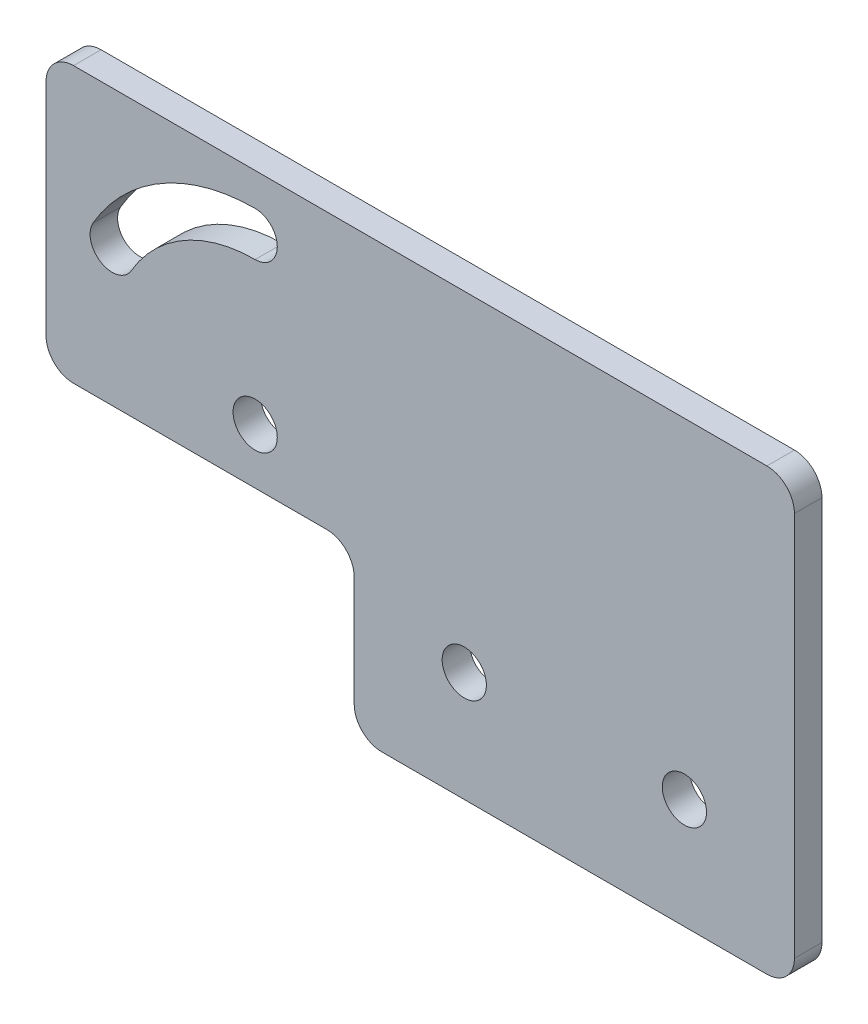
ISO-10303-21;
HEADER;
FILE_DESCRIPTION(('STEP AP214'),'2;1');
FILE_NAME('part.step','',(''),(''),'','','');
FILE_SCHEMA(('AUTOMOTIVE_DESIGN { 1 0 10303 214 1 1 1 1 }'));
ENDSEC;
DATA;
#1=APPLICATION_CONTEXT('core data for automotive mechanical design processes');
#2=APPLICATION_PROTOCOL_DEFINITION('international standard','automotive_design',2000,#1);
#3=PRODUCT_CONTEXT('',#1,'mechanical');
#4=PRODUCT('Part','Part','',(#3));
#5=PRODUCT_RELATED_PRODUCT_CATEGORY('part','',(#4));
#6=PRODUCT_DEFINITION_FORMATION('','',#4);
#7=PRODUCT_DEFINITION_CONTEXT('part definition',#1,'design');
#8=PRODUCT_DEFINITION('design','',#6,#7);
#9=PRODUCT_DEFINITION_SHAPE('','',#8);
#10=(LENGTH_UNIT() NAMED_UNIT(*) SI_UNIT(.MILLI.,.METRE.));
#11=(NAMED_UNIT(*) PLANE_ANGLE_UNIT() SI_UNIT($,.RADIAN.));
#12=(NAMED_UNIT(*) SI_UNIT($,.STERADIAN.) SOLID_ANGLE_UNIT());
#13=UNCERTAINTY_MEASURE_WITH_UNIT(LENGTH_MEASURE(1.E-05),#10,'distance_accuracy_value','');
#14=(GEOMETRIC_REPRESENTATION_CONTEXT(3) GLOBAL_UNCERTAINTY_ASSIGNED_CONTEXT((#13)) GLOBAL_UNIT_ASSIGNED_CONTEXT((#10,
#11,#12)) REPRESENTATION_CONTEXT('',''));
#15=CARTESIAN_POINT('',(0.,0.,0.));
#16=DIRECTION('',(0.,0.,1.));
#17=DIRECTION('',(1.,0.,0.));
#18=AXIS2_PLACEMENT_3D('',#15,#16,#17);
#19=CARTESIAN_POINT('',(-11.43,25.4,3.175));
#20=DIRECTION('',(0.,0.,-1.));
#21=DIRECTION('',(-1.,0.,0.));
#22=AXIS2_PLACEMENT_3D('',#19,#20,#21);
#23=CYLINDRICAL_SURFACE('',#22,21.6027);
#24=CARTESIAN_POINT('',(-11.43,25.4,0.));
#25=DIRECTION('',(0.,0.,1.));
#26=DIRECTION('',(1.,0.,0.));
#27=AXIS2_PLACEMENT_3D('',#24,#25,#26);
#28=CIRCLE('',#27,21.6027);
#29=CARTESIAN_POINT('',(-30.1384869903341,36.2013499999999,0.));
#30=VERTEX_POINT('',#29);
#31=CARTESIAN_POINT('',(-11.43,47.0027,0.));
#32=VERTEX_POINT('',#31);
#33=EDGE_CURVE('E182',#30,#32,#28,.F.);
#34=ORIENTED_EDGE('',*,*,#33,.T.);
#35=DIRECTION('',(0.,0.,-1.));
#36=VECTOR('',#35,1.);
#37=CARTESIAN_POINT('',(-11.43,47.0027,3.175));
#38=LINE('',#37,#36);
#39=CARTESIAN_POINT('',(-11.43,47.0027,3.175));
#40=VERTEX_POINT('',#39);
#41=EDGE_CURVE('E161',#40,#32,#38,.T.);
#42=ORIENTED_EDGE('',*,*,#41,.F.);
#43=CARTESIAN_POINT('',(-11.43,25.4,3.175));
#44=DIRECTION('',(0.,0.,1.));
#45=DIRECTION('',(1.,0.,0.));
#46=AXIS2_PLACEMENT_3D('',#43,#44,#45);
#47=CIRCLE('',#46,21.6027);
#48=CARTESIAN_POINT('',(-30.1384869903341,36.2013499999999,3.175));
#49=VERTEX_POINT('',#48);
#50=EDGE_CURVE('E169',#49,#40,#47,.F.);
#51=ORIENTED_EDGE('',*,*,#50,.F.);
#52=DIRECTION('',(0.,0.,-1.));
#53=VECTOR('',#52,1.);
#54=CARTESIAN_POINT('',(-30.1384869903341,36.2013499999999,3.175));
#55=LINE('',#54,#53);
#56=EDGE_CURVE('E301',#49,#30,#55,.T.);
#57=ORIENTED_EDGE('',*,*,#56,.T.);
#58=EDGE_LOOP('',(#34,#42,#51,#57));
#59=FACE_BOUND('',#58,.T.);
#60=ADVANCED_FACE('F41',(#59),#23,.F.);
#61=CARTESIAN_POINT('',(-11.43,44.45,3.175));
#62=DIRECTION('',(0.,0.,-1.));
#63=DIRECTION('',(-1.,0.,0.));
#64=AXIS2_PLACEMENT_3D('',#61,#62,#63);
#65=CYLINDRICAL_SURFACE('',#64,2.5527);
#66=CARTESIAN_POINT('',(-11.43,44.45,0.));
#67=DIRECTION('',(0.,0.,1.));
#68=DIRECTION('',(1.,0.,0.));
#69=AXIS2_PLACEMENT_3D('',#66,#67,#68);
#70=CIRCLE('',#69,2.5527);
#71=CARTESIAN_POINT('',(-11.43,41.8973,0.));
#72=VERTEX_POINT('',#71);
#73=EDGE_CURVE('E333',#32,#72,#70,.F.);
#74=ORIENTED_EDGE('',*,*,#73,.T.);
#75=DIRECTION('',(0.,0.,-1.));
#76=VECTOR('',#75,1.);
#77=CARTESIAN_POINT('',(-11.43,41.8973,3.175));
#78=LINE('',#77,#76);
#79=CARTESIAN_POINT('',(-11.43,41.8973,3.175));
#80=VERTEX_POINT('',#79);
#81=EDGE_CURVE('E163',#80,#72,#78,.T.);
#82=ORIENTED_EDGE('',*,*,#81,.F.);
#83=CARTESIAN_POINT('',(-11.43,44.45,3.175));
#84=DIRECTION('',(0.,0.,1.));
#85=DIRECTION('',(1.,0.,0.));
#86=AXIS2_PLACEMENT_3D('',#83,#84,#85);
#87=CIRCLE('',#86,2.5527);
#88=EDGE_CURVE('E156',#40,#80,#87,.F.);
#89=ORIENTED_EDGE('',*,*,#88,.F.);
#90=ORIENTED_EDGE('',*,*,#41,.T.);
#91=EDGE_LOOP('',(#74,#82,#89,#90));
#92=FACE_BOUND('',#91,.T.);
#93=ADVANCED_FACE('F159',(#92),#65,.F.);
#94=CARTESIAN_POINT('',(-11.43,25.4,3.175));
#95=DIRECTION('',(0.,0.,-1.));
#96=DIRECTION('',(-1.,0.,0.));
#97=AXIS2_PLACEMENT_3D('',#94,#95,#96);
#98=CYLINDRICAL_SURFACE('',#97,16.4973);
#99=CARTESIAN_POINT('',(-11.43,25.4,0.));
#100=DIRECTION('',(0.,0.,1.));
#101=DIRECTION('',(1.,0.,0.));
#102=AXIS2_PLACEMENT_3D('',#99,#100,#101);
#103=CIRCLE('',#102,16.4973);
#104=CARTESIAN_POINT('',(-25.717080893853,33.64865,0.));
#105=VERTEX_POINT('',#104);
#106=EDGE_CURVE('E336',#105,#72,#103,.F.);
#107=ORIENTED_EDGE('',*,*,#106,.F.);
#108=DIRECTION('',(0.,0.,-1.));
#109=VECTOR('',#108,1.);
#110=CARTESIAN_POINT('',(-25.717080893853,33.64865,3.175));
#111=LINE('',#110,#109);
#112=CARTESIAN_POINT('',(-25.717080893853,33.64865,3.175));
#113=VERTEX_POINT('',#112);
#114=EDGE_CURVE('E190',#113,#105,#111,.T.);
#115=ORIENTED_EDGE('',*,*,#114,.F.);
#116=CARTESIAN_POINT('',(-11.43,25.4,3.175));
#117=DIRECTION('',(0.,0.,1.));
#118=DIRECTION('',(1.,0.,0.));
#119=AXIS2_PLACEMENT_3D('',#116,#117,#118);
#120=CIRCLE('',#119,16.4973);
#121=EDGE_CURVE('E168',#113,#80,#120,.F.);
#122=ORIENTED_EDGE('',*,*,#121,.T.);
#123=ORIENTED_EDGE('',*,*,#81,.T.);
#124=EDGE_LOOP('',(#107,#115,#122,#123));
#125=FACE_BOUND('',#124,.T.);
#126=ADVANCED_FACE('F352',(#125),#98,.T.);
#127=CARTESIAN_POINT('',(0.,0.,3.175));
#128=DIRECTION('',(0.,1.,0.));
#129=DIRECTION('',(0.,0.,1.));
#130=AXIS2_PLACEMENT_3D('',#127,#128,#129);
#131=PLANE('',#130);
#132=DIRECTION('',(1.,0.,0.));
#133=VECTOR('',#132,1.);
#134=CARTESIAN_POINT('',(0.,0.,3.175));
#135=LINE('',#134,#133);
#136=CARTESIAN_POINT('',(3.175,0.,3.175));
#137=VERTEX_POINT('',#136);
#138=CARTESIAN_POINT('',(47.625,0.,3.175));
#139=VERTEX_POINT('',#138);
#140=EDGE_CURVE('E426',#137,#139,#135,.T.);
#141=ORIENTED_EDGE('',*,*,#140,.F.);
#142=DIRECTION('',(0.,0.,-1.));
#143=VECTOR('',#142,1.);
#144=CARTESIAN_POINT('',(3.175,0.,0.));
#145=LINE('',#144,#143);
#146=CARTESIAN_POINT('',(3.175,0.,0.));
#147=VERTEX_POINT('',#146);
#148=EDGE_CURVE('E188',#137,#147,#145,.T.);
#149=ORIENTED_EDGE('',*,*,#148,.T.);
#150=DIRECTION('',(1.,0.,0.));
#151=VECTOR('',#150,1.);
#152=CARTESIAN_POINT('',(0.,0.,0.));
#153=LINE('',#152,#151);
#154=CARTESIAN_POINT('',(47.625,0.,0.));
#155=VERTEX_POINT('',#154);
#156=EDGE_CURVE('E310',#147,#155,#153,.T.);
#157=ORIENTED_EDGE('',*,*,#156,.T.);
#158=DIRECTION('',(0.,0.,-1.));
#159=VECTOR('',#158,1.);
#160=CARTESIAN_POINT('',(47.625,0.,3.175));
#161=LINE('',#160,#159);
#162=EDGE_CURVE('E184',#155,#139,#161,.F.);
#163=ORIENTED_EDGE('',*,*,#162,.T.);
#164=EDGE_LOOP('',(#141,#149,#157,#163));
#165=FACE_BOUND('',#164,.T.);
#166=ADVANCED_FACE('F354',(#165),#131,.F.);
#167=CARTESIAN_POINT('',(50.8,0.,3.175));
#168=DIRECTION('',(-1.,0.,0.));
#169=DIRECTION('',(0.,0.,1.));
#170=AXIS2_PLACEMENT_3D('',#167,#168,#169);
#171=PLANE('',#170);
#172=DIRECTION('',(0.,1.,0.));
#173=VECTOR('',#172,1.);
#174=CARTESIAN_POINT('',(50.8,0.,0.));
#175=LINE('',#174,#173);
#176=CARTESIAN_POINT('',(50.8,3.175,0.));
#177=VERTEX_POINT('',#176);
#178=CARTESIAN_POINT('',(50.8,47.625,0.));
#179=VERTEX_POINT('',#178);
#180=EDGE_CURVE('E314',#177,#179,#175,.T.);
#181=ORIENTED_EDGE('',*,*,#180,.T.);
#182=DIRECTION('',(0.,0.,-1.));
#183=VECTOR('',#182,1.);
#184=CARTESIAN_POINT('',(50.8,47.625,3.175));
#185=LINE('',#184,#183);
#186=CARTESIAN_POINT('',(50.8,47.625,3.175));
#187=VERTEX_POINT('',#186);
#188=EDGE_CURVE('E257',#179,#187,#185,.F.);
#189=ORIENTED_EDGE('',*,*,#188,.T.);
#190=DIRECTION('',(0.,1.,0.));
#191=VECTOR('',#190,1.);
#192=CARTESIAN_POINT('',(50.8,0.,3.175));
#193=LINE('',#192,#191);
#194=CARTESIAN_POINT('',(50.8,3.175,3.175));
#195=VERTEX_POINT('',#194);
#196=EDGE_CURVE('E423',#195,#187,#193,.T.);
#197=ORIENTED_EDGE('',*,*,#196,.F.);
#198=DIRECTION('',(0.,0.,-1.));
#199=VECTOR('',#198,1.);
#200=CARTESIAN_POINT('',(50.8,3.175,3.175));
#201=LINE('',#200,#199);
#202=EDGE_CURVE('E253',#195,#177,#201,.T.);
#203=ORIENTED_EDGE('',*,*,#202,.T.);
#204=EDGE_LOOP('',(#181,#189,#197,#203));
#205=FACE_BOUND('',#204,.T.);
#206=ADVANCED_FACE('F360',(#205),#171,.F.);
#207=CARTESIAN_POINT('',(0.,50.8,3.175));
#208=DIRECTION('',(0.,1.,0.));
#209=DIRECTION('',(0.,0.,1.));
#210=AXIS2_PLACEMENT_3D('',#207,#208,#209);
#211=PLANE('',#210);
#212=DIRECTION('',(1.,0.,0.));
#213=VECTOR('',#212,1.);
#214=CARTESIAN_POINT('',(0.,50.8,3.175));
#215=LINE('',#214,#213);
#216=CARTESIAN_POINT('',(-32.385,50.8,3.175));
#217=VERTEX_POINT('',#216);
#218=CARTESIAN_POINT('',(47.625,50.8,3.175));
#219=VERTEX_POINT('',#218);
#220=EDGE_CURVE('E430',#217,#219,#215,.T.);
#221=ORIENTED_EDGE('',*,*,#220,.T.);
#222=DIRECTION('',(0.,0.,-1.));
#223=VECTOR('',#222,1.);
#224=CARTESIAN_POINT('',(47.625,50.8,0.));
#225=LINE('',#224,#223);
#226=CARTESIAN_POINT('',(47.625,50.8,0.));
#227=VERTEX_POINT('',#226);
#228=EDGE_CURVE('E249',#219,#227,#225,.T.);
#229=ORIENTED_EDGE('',*,*,#228,.T.);
#230=DIRECTION('',(1.,0.,0.));
#231=VECTOR('',#230,1.);
#232=CARTESIAN_POINT('',(0.,50.8,0.));
#233=LINE('',#232,#231);
#234=CARTESIAN_POINT('',(-32.385,50.8,0.));
#235=VERTEX_POINT('',#234);
#236=EDGE_CURVE('E318',#235,#227,#233,.T.);
#237=ORIENTED_EDGE('',*,*,#236,.F.);
#238=DIRECTION('',(0.,0.,-1.));
#239=VECTOR('',#238,1.);
#240=CARTESIAN_POINT('',(-32.385,50.8,3.175));
#241=LINE('',#240,#239);
#242=EDGE_CURVE('E246',#235,#217,#241,.F.);
#243=ORIENTED_EDGE('',*,*,#242,.T.);
#244=EDGE_LOOP('',(#221,#229,#237,#243));
#245=FACE_BOUND('',#244,.T.);
#246=ADVANCED_FACE('F382',(#245),#211,.T.);
#247=CARTESIAN_POINT('',(-35.56,0.,3.175));
#248=DIRECTION('',(1.,0.,0.));
#249=DIRECTION('',(0.,0.,-1.));
#250=AXIS2_PLACEMENT_3D('',#247,#248,#249);
#251=PLANE('',#250);
#252=DIRECTION('',(0.,-1.,0.));
#253=VECTOR('',#252,1.);
#254=CARTESIAN_POINT('',(-35.56,0.,0.));
#255=LINE('',#254,#253);
#256=CARTESIAN_POINT('',(-35.56,47.625,0.));
#257=VERTEX_POINT('',#256);
#258=CARTESIAN_POINT('',(-35.56,22.225,0.));
#259=VERTEX_POINT('',#258);
#260=EDGE_CURVE('E274',#257,#259,#255,.T.);
#261=ORIENTED_EDGE('',*,*,#260,.T.);
#262=DIRECTION('',(0.,0.,-1.));
#263=VECTOR('',#262,1.);
#264=CARTESIAN_POINT('',(-35.56,22.225,3.175));
#265=LINE('',#264,#263);
#266=CARTESIAN_POINT('',(-35.56,22.225,3.175));
#267=VERTEX_POINT('',#266);
#268=EDGE_CURVE('E243',#259,#267,#265,.F.);
#269=ORIENTED_EDGE('',*,*,#268,.T.);
#270=DIRECTION('',(0.,-1.,0.));
#271=VECTOR('',#270,1.);
#272=CARTESIAN_POINT('',(-35.56,0.,3.175));
#273=LINE('',#272,#271);
#274=CARTESIAN_POINT('',(-35.56,47.625,3.175));
#275=VERTEX_POINT('',#274);
#276=EDGE_CURVE('E293',#275,#267,#273,.T.);
#277=ORIENTED_EDGE('',*,*,#276,.F.);
#278=DIRECTION('',(0.,0.,-1.));
#279=VECTOR('',#278,1.);
#280=CARTESIAN_POINT('',(-35.56,47.625,0.));
#281=LINE('',#280,#279);
#282=EDGE_CURVE('E239',#275,#257,#281,.T.);
#283=ORIENTED_EDGE('',*,*,#282,.T.);
#284=EDGE_LOOP('',(#261,#269,#277,#283));
#285=FACE_BOUND('',#284,.T.);
#286=ADVANCED_FACE('F379',(#285),#251,.F.);
#287=CARTESIAN_POINT('',(0.,19.05,3.175));
#288=DIRECTION('',(0.,1.,0.));
#289=DIRECTION('',(-1.,0.,0.));
#290=AXIS2_PLACEMENT_3D('',#287,#288,#289);
#291=PLANE('',#290);
#292=DIRECTION('',(1.,0.,0.));
#293=VECTOR('',#292,1.);
#294=CARTESIAN_POINT('',(0.,19.05,0.));
#295=LINE('',#294,#293);
#296=CARTESIAN_POINT('',(-32.385,19.05,0.));
#297=VERTEX_POINT('',#296);
#298=CARTESIAN_POINT('',(-3.175,19.05,0.));
#299=VERTEX_POINT('',#298);
#300=EDGE_CURVE('E266',#297,#299,#295,.T.);
#301=ORIENTED_EDGE('',*,*,#300,.T.);
#302=DIRECTION('',(0.,0.,-1.));
#303=VECTOR('',#302,1.);
#304=CARTESIAN_POINT('',(-3.175,19.05,3.175));
#305=LINE('',#304,#303);
#306=CARTESIAN_POINT('',(-3.175,19.05,3.175));
#307=VERTEX_POINT('',#306);
#308=EDGE_CURVE('E57',#299,#307,#305,.F.);
#309=ORIENTED_EDGE('',*,*,#308,.T.);
#310=DIRECTION('',(1.,0.,0.));
#311=VECTOR('',#310,1.);
#312=CARTESIAN_POINT('',(0.,19.05,3.175));
#313=LINE('',#312,#311);
#314=CARTESIAN_POINT('',(-32.385,19.05,3.175));
#315=VERTEX_POINT('',#314);
#316=EDGE_CURVE('E283',#315,#307,#313,.T.);
#317=ORIENTED_EDGE('',*,*,#316,.F.);
#318=DIRECTION('',(0.,0.,-1.));
#319=VECTOR('',#318,1.);
#320=CARTESIAN_POINT('',(-32.385,19.05,3.175));
#321=LINE('',#320,#319);
#322=EDGE_CURVE('E233',#315,#297,#321,.T.);
#323=ORIENTED_EDGE('',*,*,#322,.T.);
#324=EDGE_LOOP('',(#301,#309,#317,#323));
#325=FACE_BOUND('',#324,.T.);
#326=ADVANCED_FACE('F271',(#325),#291,.F.);
#327=CARTESIAN_POINT('',(-11.43,25.4,3.175));
#328=DIRECTION('',(0.,0.,-1.));
#329=DIRECTION('',(-1.,0.,0.));
#330=AXIS2_PLACEMENT_3D('',#327,#328,#329);
#331=CYLINDRICAL_SURFACE('',#330,2.5527);
#332=CARTESIAN_POINT('',(-11.43,25.4,3.175));
#333=DIRECTION('',(0.,0.,1.));
#334=DIRECTION('',(1.,0.,0.));
#335=AXIS2_PLACEMENT_3D('',#332,#333,#334);
#336=CIRCLE('',#335,2.5527);
#337=CARTESIAN_POINT('',(-8.8773,25.4,3.175));
#338=VERTEX_POINT('',#337);
#339=EDGE_CURVE('E179',#338,#338,#336,.T.);
#340=ORIENTED_EDGE('',*,*,#339,.T.);
#341=EDGE_LOOP('',(#340));
#342=FACE_BOUND('',#341,.T.);
#343=CARTESIAN_POINT('',(-11.43,25.4,0.));
#344=DIRECTION('',(0.,0.,1.));
#345=DIRECTION('',(1.,0.,0.));
#346=AXIS2_PLACEMENT_3D('',#343,#344,#345);
#347=CIRCLE('',#346,2.5527);
#348=CARTESIAN_POINT('',(-8.8773,25.4,0.));
#349=VERTEX_POINT('',#348);
#350=EDGE_CURVE('E327',#349,#349,#347,.T.);
#351=ORIENTED_EDGE('',*,*,#350,.F.);
#352=EDGE_LOOP('',(#351));
#353=FACE_BOUND('',#352,.T.);
#354=ADVANCED_FACE('F370',(#342,#353),#331,.F.);
#355=CARTESIAN_POINT('',(0.,0.,3.175));
#356=DIRECTION('',(-1.,0.,0.));
#357=DIRECTION('',(0.,0.,1.));
#358=AXIS2_PLACEMENT_3D('',#355,#356,#357);
#359=PLANE('',#358);
#360=DIRECTION('',(0.,1.,0.));
#361=VECTOR('',#360,1.);
#362=CARTESIAN_POINT('',(0.,0.,0.));
#363=LINE('',#362,#361);
#364=CARTESIAN_POINT('',(0.,3.175,0.));
#365=VERTEX_POINT('',#364);
#366=CARTESIAN_POINT('',(0.,15.875,0.));
#367=VERTEX_POINT('',#366);
#368=EDGE_CURVE('E268',#365,#367,#363,.T.);
#369=ORIENTED_EDGE('',*,*,#368,.F.);
#370=DIRECTION('',(0.,0.,-1.));
#371=VECTOR('',#370,1.);
#372=CARTESIAN_POINT('',(0.,3.175,3.175));
#373=LINE('',#372,#371);
#374=CARTESIAN_POINT('',(0.,3.175,3.175));
#375=VERTEX_POINT('',#374);
#376=EDGE_CURVE('E216',#365,#375,#373,.F.);
#377=ORIENTED_EDGE('',*,*,#376,.T.);
#378=DIRECTION('',(0.,1.,0.));
#379=VECTOR('',#378,1.);
#380=CARTESIAN_POINT('',(0.,0.,3.175));
#381=LINE('',#380,#379);
#382=CARTESIAN_POINT('',(0.,15.875,3.175));
#383=VERTEX_POINT('',#382);
#384=EDGE_CURVE('E281',#375,#383,#381,.T.);
#385=ORIENTED_EDGE('',*,*,#384,.T.);
#386=DIRECTION('',(0.,0.,-1.));
#387=VECTOR('',#386,1.);
#388=CARTESIAN_POINT('',(0.,15.875,3.175));
#389=LINE('',#388,#387);
#390=EDGE_CURVE('E212',#383,#367,#389,.T.);
#391=ORIENTED_EDGE('',*,*,#390,.T.);
#392=EDGE_LOOP('',(#369,#377,#385,#391));
#393=FACE_BOUND('',#392,.T.);
#394=ADVANCED_FACE('F285',(#393),#359,.T.);
#395=CARTESIAN_POINT('',(12.7,12.7,3.175));
#396=DIRECTION('',(0.,0.,-1.));
#397=DIRECTION('',(-1.,0.,0.));
#398=AXIS2_PLACEMENT_3D('',#395,#396,#397);
#399=CYLINDRICAL_SURFACE('',#398,2.5527);
#400=CARTESIAN_POINT('',(12.7,12.7,3.175));
#401=DIRECTION('',(0.,0.,1.));
#402=DIRECTION('',(1.,0.,0.));
#403=AXIS2_PLACEMENT_3D('',#400,#401,#402);
#404=CIRCLE('',#403,2.5527);
#405=CARTESIAN_POINT('',(15.2527,12.7,3.175));
#406=VERTEX_POINT('',#405);
#407=EDGE_CURVE('E436',#406,#406,#404,.T.);
#408=ORIENTED_EDGE('',*,*,#407,.T.);
#409=EDGE_LOOP('',(#408));
#410=FACE_BOUND('',#409,.T.);
#411=CARTESIAN_POINT('',(12.7,12.7,0.));
#412=DIRECTION('',(0.,0.,1.));
#413=DIRECTION('',(1.,0.,0.));
#414=AXIS2_PLACEMENT_3D('',#411,#412,#413);
#415=CIRCLE('',#414,2.5527);
#416=CARTESIAN_POINT('',(15.2527,12.7,0.));
#417=VERTEX_POINT('',#416);
#418=EDGE_CURVE('E306',#417,#417,#415,.T.);
#419=ORIENTED_EDGE('',*,*,#418,.F.);
#420=EDGE_LOOP('',(#419));
#421=FACE_BOUND('',#420,.T.);
#422=ADVANCED_FACE('F376',(#410,#421),#399,.F.);
#423=CARTESIAN_POINT('',(38.1,12.7,3.175));
#424=DIRECTION('',(0.,0.,-1.));
#425=DIRECTION('',(-1.,0.,0.));
#426=AXIS2_PLACEMENT_3D('',#423,#424,#425);
#427=CYLINDRICAL_SURFACE('',#426,2.5527);
#428=CARTESIAN_POINT('',(38.1,12.7,3.175));
#429=DIRECTION('',(0.,0.,1.));
#430=DIRECTION('',(1.,0.,0.));
#431=AXIS2_PLACEMENT_3D('',#428,#429,#430);
#432=CIRCLE('',#431,2.5527);
#433=CARTESIAN_POINT('',(40.6527,12.7,3.175));
#434=VERTEX_POINT('',#433);
#435=EDGE_CURVE('E343',#434,#434,#432,.T.);
#436=ORIENTED_EDGE('',*,*,#435,.T.);
#437=EDGE_LOOP('',(#436));
#438=FACE_BOUND('',#437,.T.);
#439=CARTESIAN_POINT('',(38.1,12.7,0.));
#440=DIRECTION('',(0.,0.,1.));
#441=DIRECTION('',(1.,0.,0.));
#442=AXIS2_PLACEMENT_3D('',#439,#440,#441);
#443=CIRCLE('',#442,2.5527);
#444=CARTESIAN_POINT('',(40.6527,12.7,0.));
#445=VERTEX_POINT('',#444);
#446=EDGE_CURVE('E302',#445,#445,#443,.T.);
#447=ORIENTED_EDGE('',*,*,#446,.F.);
#448=EDGE_LOOP('',(#447));
#449=FACE_BOUND('',#448,.T.);
#450=ADVANCED_FACE('F392',(#438,#449),#427,.F.);
#451=CARTESIAN_POINT('',(-27.9277839420936,34.925,3.175));
#452=DIRECTION('',(0.,0.,-1.));
#453=DIRECTION('',(-1.,0.,0.));
#454=AXIS2_PLACEMENT_3D('',#451,#452,#453);
#455=CYLINDRICAL_SURFACE('',#454,2.5527);
#456=CARTESIAN_POINT('',(-27.9277839420936,34.925,0.));
#457=DIRECTION('',(0.,0.,1.));
#458=DIRECTION('',(1.,0.,0.));
#459=AXIS2_PLACEMENT_3D('',#456,#457,#458);
#460=CIRCLE('',#459,2.5527);
#461=EDGE_CURVE('E340',#105,#30,#460,.F.);
#462=ORIENTED_EDGE('',*,*,#461,.T.);
#463=ORIENTED_EDGE('',*,*,#56,.F.);
#464=CARTESIAN_POINT('',(-27.9277839420936,34.925,3.175));
#465=DIRECTION('',(0.,0.,1.));
#466=DIRECTION('',(1.,0.,0.));
#467=AXIS2_PLACEMENT_3D('',#464,#465,#466);
#468=CIRCLE('',#467,2.5527);
#469=EDGE_CURVE('E174',#113,#49,#468,.F.);
#470=ORIENTED_EDGE('',*,*,#469,.F.);
#471=ORIENTED_EDGE('',*,*,#114,.T.);
#472=EDGE_LOOP('',(#462,#463,#470,#471));
#473=FACE_BOUND('',#472,.T.);
#474=ADVANCED_FACE('F348',(#473),#455,.F.);
#475=CARTESIAN_POINT('',(0.,0.,3.175));
#476=DIRECTION('',(0.,0.,1.));
#477=DIRECTION('',(1.,0.,0.));
#478=AXIS2_PLACEMENT_3D('',#475,#476,#477);
#479=PLANE('',#478);
#480=ORIENTED_EDGE('',*,*,#435,.F.);
#481=EDGE_LOOP('',(#480));
#482=FACE_BOUND('',#481,.T.);
#483=ORIENTED_EDGE('',*,*,#407,.F.);
#484=EDGE_LOOP('',(#483));
#485=FACE_BOUND('',#484,.T.);
#486=ORIENTED_EDGE('',*,*,#384,.F.);
#487=CARTESIAN_POINT('',(3.175,3.175,3.175));
#488=DIRECTION('',(0.,0.,1.));
#489=DIRECTION('',(1.,0.,0.));
#490=AXIS2_PLACEMENT_3D('',#487,#488,#489);
#491=CIRCLE('',#490,3.175);
#492=EDGE_CURVE('E230',#375,#137,#491,.T.);
#493=ORIENTED_EDGE('',*,*,#492,.T.);
#494=ORIENTED_EDGE('',*,*,#140,.T.);
#495=CARTESIAN_POINT('',(47.625,3.175,3.175));
#496=DIRECTION('',(0.,0.,1.));
#497=DIRECTION('',(1.,0.,0.));
#498=AXIS2_PLACEMENT_3D('',#495,#496,#497);
#499=CIRCLE('',#498,3.175);
#500=EDGE_CURVE('E222',#139,#195,#499,.T.);
#501=ORIENTED_EDGE('',*,*,#500,.T.);
#502=ORIENTED_EDGE('',*,*,#196,.T.);
#503=CARTESIAN_POINT('',(47.625,47.625,3.175));
#504=DIRECTION('',(0.,0.,1.));
#505=DIRECTION('',(1.,0.,0.));
#506=AXIS2_PLACEMENT_3D('',#503,#504,#505);
#507=CIRCLE('',#506,3.175);
#508=EDGE_CURVE('E225',#187,#219,#507,.T.);
#509=ORIENTED_EDGE('',*,*,#508,.T.);
#510=ORIENTED_EDGE('',*,*,#220,.F.);
#511=CARTESIAN_POINT('',(-32.385,47.625,3.175));
#512=DIRECTION('',(0.,0.,1.));
#513=DIRECTION('',(1.,0.,0.));
#514=AXIS2_PLACEMENT_3D('',#511,#512,#513);
#515=CIRCLE('',#514,3.175);
#516=EDGE_CURVE('E219',#217,#275,#515,.T.);
#517=ORIENTED_EDGE('',*,*,#516,.T.);
#518=ORIENTED_EDGE('',*,*,#276,.T.);
#519=CARTESIAN_POINT('',(-32.385,22.225,3.175));
#520=DIRECTION('',(0.,0.,1.));
#521=DIRECTION('',(1.,0.,0.));
#522=AXIS2_PLACEMENT_3D('',#519,#520,#521);
#523=CIRCLE('',#522,3.175);
#524=EDGE_CURVE('E64',#267,#315,#523,.T.);
#525=ORIENTED_EDGE('',*,*,#524,.T.);
#526=ORIENTED_EDGE('',*,*,#316,.T.);
#527=CARTESIAN_POINT('',(-3.175,15.875,3.175));
#528=DIRECTION('',(0.,0.,1.));
#529=DIRECTION('',(1.,0.,0.));
#530=AXIS2_PLACEMENT_3D('',#527,#528,#529);
#531=CIRCLE('',#530,3.175);
#532=EDGE_CURVE('E11',#307,#383,#531,.F.);
#533=ORIENTED_EDGE('',*,*,#532,.T.);
#534=EDGE_LOOP('',(#486,#493,#494,#501,#502,#509,#510,#517,#518,#525,#526,#533));
#535=FACE_BOUND('',#534,.T.);
#536=ORIENTED_EDGE('',*,*,#339,.F.);
#537=EDGE_LOOP('',(#536));
#538=FACE_BOUND('',#537,.T.);
#539=ORIENTED_EDGE('',*,*,#50,.T.);
#540=ORIENTED_EDGE('',*,*,#88,.T.);
#541=ORIENTED_EDGE('',*,*,#121,.F.);
#542=ORIENTED_EDGE('',*,*,#469,.T.);
#543=EDGE_LOOP('',(#539,#540,#541,#542));
#544=FACE_BOUND('',#543,.T.);
#545=ADVANCED_FACE('F172',(#482,#485,#535,#538,#544),#479,.T.);
#546=CARTESIAN_POINT('',(0.,0.,0.));
#547=DIRECTION('',(0.,0.,1.));
#548=DIRECTION('',(1.,0.,0.));
#549=AXIS2_PLACEMENT_3D('',#546,#547,#548);
#550=PLANE('',#549);
#551=ORIENTED_EDGE('',*,*,#446,.T.);
#552=EDGE_LOOP('',(#551));
#553=FACE_BOUND('',#552,.T.);
#554=ORIENTED_EDGE('',*,*,#418,.T.);
#555=EDGE_LOOP('',(#554));
#556=FACE_BOUND('',#555,.T.);
#557=ORIENTED_EDGE('',*,*,#156,.F.);
#558=CARTESIAN_POINT('',(3.175,3.175,0.));
#559=DIRECTION('',(0.,0.,1.));
#560=DIRECTION('',(1.,0.,0.));
#561=AXIS2_PLACEMENT_3D('',#558,#559,#560);
#562=CIRCLE('',#561,3.175);
#563=EDGE_CURVE('E209',#147,#365,#562,.F.);
#564=ORIENTED_EDGE('',*,*,#563,.T.);
#565=ORIENTED_EDGE('',*,*,#368,.T.);
#566=CARTESIAN_POINT('',(-3.175,15.875,0.));
#567=DIRECTION('',(0.,0.,1.));
#568=DIRECTION('',(1.,0.,0.));
#569=AXIS2_PLACEMENT_3D('',#566,#567,#568);
#570=CIRCLE('',#569,3.175);
#571=EDGE_CURVE('E50',#367,#299,#570,.T.);
#572=ORIENTED_EDGE('',*,*,#571,.T.);
#573=ORIENTED_EDGE('',*,*,#300,.F.);
#574=CARTESIAN_POINT('',(-32.385,22.225,0.));
#575=DIRECTION('',(0.,0.,1.));
#576=DIRECTION('',(1.,0.,0.));
#577=AXIS2_PLACEMENT_3D('',#574,#575,#576);
#578=CIRCLE('',#577,3.175);
#579=EDGE_CURVE('E206',#297,#259,#578,.F.);
#580=ORIENTED_EDGE('',*,*,#579,.T.);
#581=ORIENTED_EDGE('',*,*,#260,.F.);
#582=CARTESIAN_POINT('',(-32.385,47.625,0.));
#583=DIRECTION('',(0.,0.,1.));
#584=DIRECTION('',(1.,0.,0.));
#585=AXIS2_PLACEMENT_3D('',#582,#583,#584);
#586=CIRCLE('',#585,3.175);
#587=EDGE_CURVE('E197',#257,#235,#586,.F.);
#588=ORIENTED_EDGE('',*,*,#587,.T.);
#589=ORIENTED_EDGE('',*,*,#236,.T.);
#590=CARTESIAN_POINT('',(47.625,47.625,0.));
#591=DIRECTION('',(0.,0.,1.));
#592=DIRECTION('',(1.,0.,0.));
#593=AXIS2_PLACEMENT_3D('',#590,#591,#592);
#594=CIRCLE('',#593,3.175);
#595=EDGE_CURVE('E203',#227,#179,#594,.F.);
#596=ORIENTED_EDGE('',*,*,#595,.T.);
#597=ORIENTED_EDGE('',*,*,#180,.F.);
#598=CARTESIAN_POINT('',(47.625,3.175,0.));
#599=DIRECTION('',(0.,0.,1.));
#600=DIRECTION('',(1.,0.,0.));
#601=AXIS2_PLACEMENT_3D('',#598,#599,#600);
#602=CIRCLE('',#601,3.175);
#603=EDGE_CURVE('E200',#177,#155,#602,.F.);
#604=ORIENTED_EDGE('',*,*,#603,.T.);
#605=EDGE_LOOP('',(#557,#564,#565,#572,#573,#580,#581,#588,#589,#596,#597,#604));
#606=FACE_BOUND('',#605,.T.);
#607=ORIENTED_EDGE('',*,*,#350,.T.);
#608=EDGE_LOOP('',(#607));
#609=FACE_BOUND('',#608,.T.);
#610=ORIENTED_EDGE('',*,*,#33,.F.);
#611=ORIENTED_EDGE('',*,*,#461,.F.);
#612=ORIENTED_EDGE('',*,*,#106,.T.);
#613=ORIENTED_EDGE('',*,*,#73,.F.);
#614=EDGE_LOOP('',(#610,#611,#612,#613));
#615=FACE_BOUND('',#614,.T.);
#616=ADVANCED_FACE('F264',(#553,#556,#606,#609,#615),#550,.F.);
#617=CARTESIAN_POINT('',(3.175,3.175,3.175));
#618=DIRECTION('',(0.,0.,1.));
#619=DIRECTION('',(1.,0.,0.));
#620=AXIS2_PLACEMENT_3D('',#617,#618,#619);
#621=CYLINDRICAL_SURFACE('',#620,3.175);
#622=ORIENTED_EDGE('',*,*,#492,.F.);
#623=ORIENTED_EDGE('',*,*,#376,.F.);
#624=ORIENTED_EDGE('',*,*,#563,.F.);
#625=ORIENTED_EDGE('',*,*,#148,.F.);
#626=EDGE_LOOP('',(#622,#623,#624,#625));
#627=FACE_BOUND('',#626,.T.);
#628=ADVANCED_FACE('F397',(#627),#621,.T.);
#629=CARTESIAN_POINT('',(-3.175,15.875,3.175));
#630=DIRECTION('',(0.,0.,-1.));
#631=DIRECTION('',(-1.,0.,0.));
#632=AXIS2_PLACEMENT_3D('',#629,#630,#631);
#633=CYLINDRICAL_SURFACE('',#632,3.175);
#634=ORIENTED_EDGE('',*,*,#532,.F.);
#635=ORIENTED_EDGE('',*,*,#308,.F.);
#636=ORIENTED_EDGE('',*,*,#571,.F.);
#637=ORIENTED_EDGE('',*,*,#390,.F.);
#638=EDGE_LOOP('',(#634,#635,#636,#637));
#639=FACE_BOUND('',#638,.T.);
#640=ADVANCED_FACE('F277',(#639),#633,.F.);
#641=CARTESIAN_POINT('',(-32.385,22.225,3.175));
#642=DIRECTION('',(0.,0.,-1.));
#643=DIRECTION('',(-1.,0.,0.));
#644=AXIS2_PLACEMENT_3D('',#641,#642,#643);
#645=CYLINDRICAL_SURFACE('',#644,3.175);
#646=ORIENTED_EDGE('',*,*,#524,.F.);
#647=ORIENTED_EDGE('',*,*,#268,.F.);
#648=ORIENTED_EDGE('',*,*,#579,.F.);
#649=ORIENTED_EDGE('',*,*,#322,.F.);
#650=EDGE_LOOP('',(#646,#647,#648,#649));
#651=FACE_BOUND('',#650,.T.);
#652=ADVANCED_FACE('F403',(#651),#645,.T.);
#653=CARTESIAN_POINT('',(47.625,47.625,3.175));
#654=DIRECTION('',(0.,0.,1.));
#655=DIRECTION('',(1.,0.,0.));
#656=AXIS2_PLACEMENT_3D('',#653,#654,#655);
#657=CYLINDRICAL_SURFACE('',#656,3.175);
#658=ORIENTED_EDGE('',*,*,#508,.F.);
#659=ORIENTED_EDGE('',*,*,#188,.F.);
#660=ORIENTED_EDGE('',*,*,#595,.F.);
#661=ORIENTED_EDGE('',*,*,#228,.F.);
#662=EDGE_LOOP('',(#658,#659,#660,#661));
#663=FACE_BOUND('',#662,.T.);
#664=ADVANCED_FACE('F406',(#663),#657,.T.);
#665=CARTESIAN_POINT('',(47.625,3.175,3.175));
#666=DIRECTION('',(0.,0.,-1.));
#667=DIRECTION('',(-1.,0.,0.));
#668=AXIS2_PLACEMENT_3D('',#665,#666,#667);
#669=CYLINDRICAL_SURFACE('',#668,3.175);
#670=ORIENTED_EDGE('',*,*,#500,.F.);
#671=ORIENTED_EDGE('',*,*,#162,.F.);
#672=ORIENTED_EDGE('',*,*,#603,.F.);
#673=ORIENTED_EDGE('',*,*,#202,.F.);
#674=EDGE_LOOP('',(#670,#671,#672,#673));
#675=FACE_BOUND('',#674,.T.);
#676=ADVANCED_FACE('F409',(#675),#669,.T.);
#677=CARTESIAN_POINT('',(-32.385,47.625,3.175));
#678=DIRECTION('',(0.,0.,1.));
#679=DIRECTION('',(1.,0.,0.));
#680=AXIS2_PLACEMENT_3D('',#677,#678,#679);
#681=CYLINDRICAL_SURFACE('',#680,3.175);
#682=ORIENTED_EDGE('',*,*,#516,.F.);
#683=ORIENTED_EDGE('',*,*,#242,.F.);
#684=ORIENTED_EDGE('',*,*,#587,.F.);
#685=ORIENTED_EDGE('',*,*,#282,.F.);
#686=EDGE_LOOP('',(#682,#683,#684,#685));
#687=FACE_BOUND('',#686,.T.);
#688=ADVANCED_FACE('F43',(#687),#681,.T.);
#689=CLOSED_SHELL('',(#60,#93,#126,#166,#206,#246,#286,#326,#354,#394,#422,#450,#474,#545,#616,
#628,#640,#652,#664,#676,#688));
#690=MANIFOLD_SOLID_BREP('B2',#689);
#691=ADVANCED_BREP_SHAPE_REPRESENTATION('',(#18,#690),#14);
#692=SHAPE_DEFINITION_REPRESENTATION(#9,#691);
ENDSEC;
END-ISO-10303-21;
